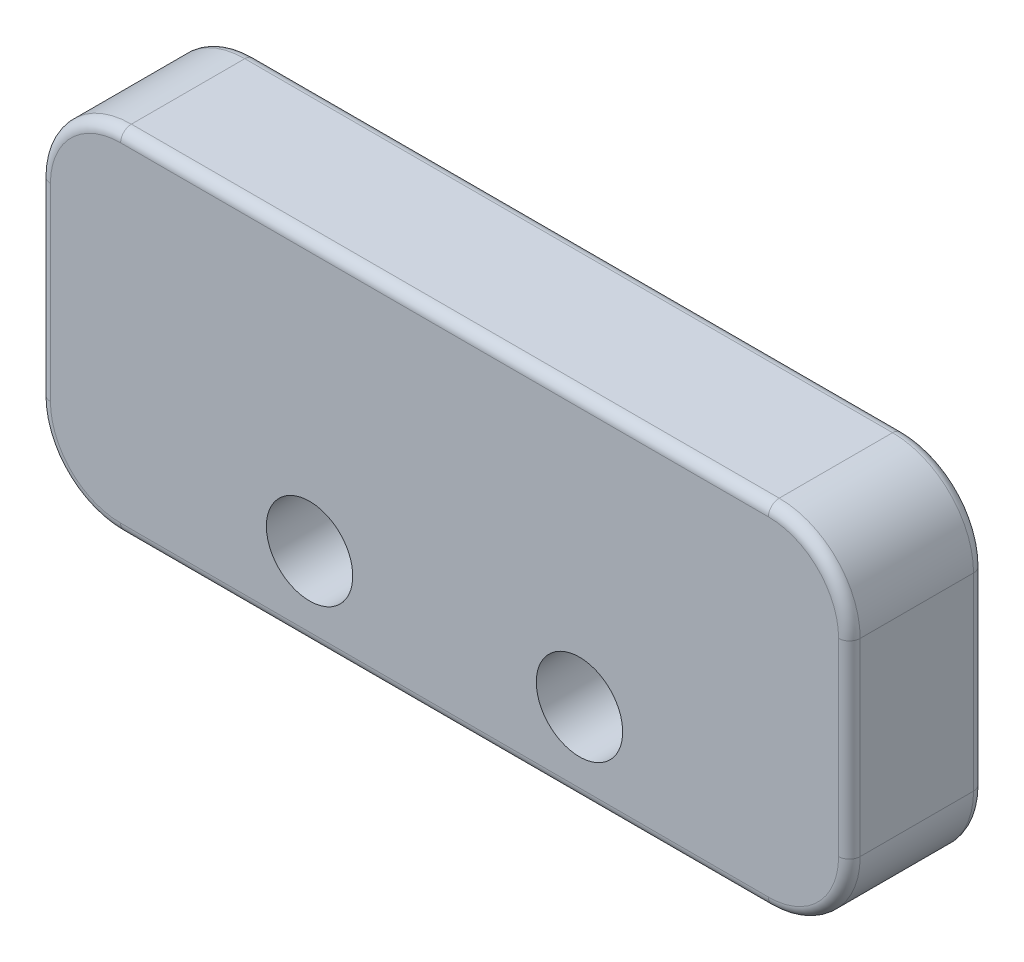
ISO-10303-21;
HEADER;
FILE_DESCRIPTION(('STEP AP214'),'2;1');
FILE_NAME('part.step','',(''),(''),'','','');
FILE_SCHEMA(('AUTOMOTIVE_DESIGN { 1 0 10303 214 1 1 1 1 }'));
ENDSEC;
DATA;
#1=APPLICATION_CONTEXT('core data for automotive mechanical design processes');
#2=APPLICATION_PROTOCOL_DEFINITION('international standard','automotive_design',2000,#1);
#3=PRODUCT_CONTEXT('',#1,'mechanical');
#4=PRODUCT('Part','Part','',(#3));
#5=PRODUCT_RELATED_PRODUCT_CATEGORY('part','',(#4));
#6=PRODUCT_DEFINITION_FORMATION('','',#4);
#7=PRODUCT_DEFINITION_CONTEXT('part definition',#1,'design');
#8=PRODUCT_DEFINITION('design','',#6,#7);
#9=PRODUCT_DEFINITION_SHAPE('','',#8);
#10=(LENGTH_UNIT() NAMED_UNIT(*) SI_UNIT(.MILLI.,.METRE.));
#11=(NAMED_UNIT(*) PLANE_ANGLE_UNIT() SI_UNIT($,.RADIAN.));
#12=(NAMED_UNIT(*) SI_UNIT($,.STERADIAN.) SOLID_ANGLE_UNIT());
#13=UNCERTAINTY_MEASURE_WITH_UNIT(LENGTH_MEASURE(1.E-05),#10,'distance_accuracy_value','');
#14=(GEOMETRIC_REPRESENTATION_CONTEXT(3) GLOBAL_UNCERTAINTY_ASSIGNED_CONTEXT((#13)) GLOBAL_UNIT_ASSIGNED_CONTEXT((#10,
#11,#12)) REPRESENTATION_CONTEXT('',''));
#15=CARTESIAN_POINT('',(0.,0.,0.));
#16=DIRECTION('',(0.,0.,1.));
#17=DIRECTION('',(1.,0.,0.));
#18=AXIS2_PLACEMENT_3D('',#15,#16,#17);
#19=CARTESIAN_POINT('',(0.,0.,5.));
#20=DIRECTION('',(1.,0.,0.));
#21=DIRECTION('',(0.,1.,0.));
#22=AXIS2_PLACEMENT_3D('',#19,#20,#21);
#23=PLANE('',#22);
#24=DIRECTION('',(0.,0.,-1.));
#25=VECTOR('',#24,1.);
#26=CARTESIAN_POINT('',(0.,-10.,5.));
#27=LINE('',#26,#25);
#28=CARTESIAN_POINT('',(0.,-10.,0.4));
#29=VERTEX_POINT('',#28);
#30=CARTESIAN_POINT('',(0.,-10.,4.6));
#31=VERTEX_POINT('',#30);
#32=EDGE_CURVE('E280',#29,#31,#27,.F.);
#33=ORIENTED_EDGE('',*,*,#32,.T.);
#34=DIRECTION('',(0.,-1.,0.));
#35=VECTOR('',#34,1.);
#36=CARTESIAN_POINT('',(0.,-3.,4.6));
#37=LINE('',#36,#35);
#38=CARTESIAN_POINT('',(0.,-3.,4.6));
#39=VERTEX_POINT('',#38);
#40=EDGE_CURVE('E202',#31,#39,#37,.F.);
#41=ORIENTED_EDGE('',*,*,#40,.T.);
#42=DIRECTION('',(0.,0.,-1.));
#43=VECTOR('',#42,1.);
#44=CARTESIAN_POINT('',(0.,-3.,5.));
#45=LINE('',#44,#43);
#46=CARTESIAN_POINT('',(0.,-3.,0.4));
#47=VERTEX_POINT('',#46);
#48=EDGE_CURVE('E339',#39,#47,#45,.T.);
#49=ORIENTED_EDGE('',*,*,#48,.T.);
#50=DIRECTION('',(0.,-1.,0.));
#51=VECTOR('',#50,1.);
#52=CARTESIAN_POINT('',(0.,0.,0.4));
#53=LINE('',#52,#51);
#54=EDGE_CURVE('E200',#47,#29,#53,.T.);
#55=ORIENTED_EDGE('',*,*,#54,.T.);
#56=EDGE_LOOP('',(#33,#41,#49,#55));
#57=FACE_BOUND('',#56,.T.);
#58=ADVANCED_FACE('F32',(#57),#23,.F.);
#59=CARTESIAN_POINT('',(0.,-13.,5.));
#60=DIRECTION('',(0.,1.,0.));
#61=DIRECTION('',(0.,0.,1.));
#62=AXIS2_PLACEMENT_3D('',#59,#60,#61);
#63=PLANE('',#62);
#64=DIRECTION('',(0.,0.,-1.));
#65=VECTOR('',#64,1.);
#66=CARTESIAN_POINT('',(27.,-13.,5.));
#67=LINE('',#66,#65);
#68=CARTESIAN_POINT('',(27.,-13.,0.4));
#69=VERTEX_POINT('',#68);
#70=CARTESIAN_POINT('',(27.,-13.,4.6));
#71=VERTEX_POINT('',#70);
#72=EDGE_CURVE('E287',#69,#71,#67,.F.);
#73=ORIENTED_EDGE('',*,*,#72,.T.);
#74=DIRECTION('',(1.,0.,0.));
#75=VECTOR('',#74,1.);
#76=CARTESIAN_POINT('',(3.,-13.,4.6));
#77=LINE('',#76,#75);
#78=CARTESIAN_POINT('',(3.,-13.,4.6));
#79=VERTEX_POINT('',#78);
#80=EDGE_CURVE('E194',#71,#79,#77,.F.);
#81=ORIENTED_EDGE('',*,*,#80,.T.);
#82=DIRECTION('',(0.,0.,-1.));
#83=VECTOR('',#82,1.);
#84=CARTESIAN_POINT('',(3.,-13.,5.));
#85=LINE('',#84,#83);
#86=CARTESIAN_POINT('',(3.,-13.,0.4));
#87=VERTEX_POINT('',#86);
#88=EDGE_CURVE('E277',#79,#87,#85,.T.);
#89=ORIENTED_EDGE('',*,*,#88,.T.);
#90=DIRECTION('',(1.,0.,0.));
#91=VECTOR('',#90,1.);
#92=CARTESIAN_POINT('',(0.,-13.,0.4));
#93=LINE('',#92,#91);
#94=EDGE_CURVE('E192',#87,#69,#93,.T.);
#95=ORIENTED_EDGE('',*,*,#94,.T.);
#96=EDGE_LOOP('',(#73,#81,#89,#95));
#97=FACE_BOUND('',#96,.T.);
#98=ADVANCED_FACE('F283',(#97),#63,.F.);
#99=CARTESIAN_POINT('',(30.,0.,5.));
#100=DIRECTION('',(-1.,0.,0.));
#101=DIRECTION('',(0.,0.,1.));
#102=AXIS2_PLACEMENT_3D('',#99,#100,#101);
#103=PLANE('',#102);
#104=DIRECTION('',(0.,0.,-1.));
#105=VECTOR('',#104,1.);
#106=CARTESIAN_POINT('',(30.,-3.,5.));
#107=LINE('',#106,#105);
#108=CARTESIAN_POINT('',(30.,-3.,0.4));
#109=VERTEX_POINT('',#108);
#110=CARTESIAN_POINT('',(30.,-3.,4.6));
#111=VERTEX_POINT('',#110);
#112=EDGE_CURVE('E286',#109,#111,#107,.F.);
#113=ORIENTED_EDGE('',*,*,#112,.T.);
#114=DIRECTION('',(0.,1.,0.));
#115=VECTOR('',#114,1.);
#116=CARTESIAN_POINT('',(30.,-9.99999999999999,4.6));
#117=LINE('',#116,#115);
#118=CARTESIAN_POINT('',(30.,-10.,4.6));
#119=VERTEX_POINT('',#118);
#120=EDGE_CURVE('E186',#111,#119,#117,.F.);
#121=ORIENTED_EDGE('',*,*,#120,.T.);
#122=DIRECTION('',(0.,0.,-1.));
#123=VECTOR('',#122,1.);
#124=CARTESIAN_POINT('',(30.,-10.,5.));
#125=LINE('',#124,#123);
#126=CARTESIAN_POINT('',(30.,-10.,0.4));
#127=VERTEX_POINT('',#126);
#128=EDGE_CURVE('E168',#119,#127,#125,.T.);
#129=ORIENTED_EDGE('',*,*,#128,.T.);
#130=DIRECTION('',(0.,1.,0.));
#131=VECTOR('',#130,1.);
#132=CARTESIAN_POINT('',(30.,0.,0.4));
#133=LINE('',#132,#131);
#134=EDGE_CURVE('E184',#127,#109,#133,.T.);
#135=ORIENTED_EDGE('',*,*,#134,.T.);
#136=EDGE_LOOP('',(#113,#121,#129,#135));
#137=FACE_BOUND('',#136,.T.);
#138=ADVANCED_FACE('F321',(#137),#103,.F.);
#139=CARTESIAN_POINT('',(0.,0.,5.));
#140=DIRECTION('',(0.,-1.,0.));
#141=DIRECTION('',(0.,0.,-1.));
#142=AXIS2_PLACEMENT_3D('',#139,#140,#141);
#143=PLANE('',#142);
#144=DIRECTION('',(0.,0.,-1.));
#145=VECTOR('',#144,1.);
#146=CARTESIAN_POINT('',(3.,0.,5.));
#147=LINE('',#146,#145);
#148=CARTESIAN_POINT('',(3.,0.,0.4));
#149=VERTEX_POINT('',#148);
#150=CARTESIAN_POINT('',(3.,0.,4.6));
#151=VERTEX_POINT('',#150);
#152=EDGE_CURVE('E291',#149,#151,#147,.F.);
#153=ORIENTED_EDGE('',*,*,#152,.T.);
#154=DIRECTION('',(-1.,0.,0.));
#155=VECTOR('',#154,1.);
#156=CARTESIAN_POINT('',(27.,0.,4.6));
#157=LINE('',#156,#155);
#158=CARTESIAN_POINT('',(27.,0.,4.6));
#159=VERTEX_POINT('',#158);
#160=EDGE_CURVE('E11',#151,#159,#157,.F.);
#161=ORIENTED_EDGE('',*,*,#160,.T.);
#162=DIRECTION('',(0.,0.,-1.));
#163=VECTOR('',#162,1.);
#164=CARTESIAN_POINT('',(27.,0.,5.));
#165=LINE('',#164,#163);
#166=CARTESIAN_POINT('',(27.,0.,0.4));
#167=VERTEX_POINT('',#166);
#168=EDGE_CURVE('E320',#159,#167,#165,.T.);
#169=ORIENTED_EDGE('',*,*,#168,.T.);
#170=DIRECTION('',(-1.,0.,0.));
#171=VECTOR('',#170,1.);
#172=CARTESIAN_POINT('',(0.,0.,0.4));
#173=LINE('',#172,#171);
#174=EDGE_CURVE('E41',#167,#149,#173,.T.);
#175=ORIENTED_EDGE('',*,*,#174,.T.);
#176=EDGE_LOOP('',(#153,#161,#169,#175));
#177=FACE_BOUND('',#176,.T.);
#178=ADVANCED_FACE('F338',(#177),#143,.F.);
#179=CARTESIAN_POINT('',(0.,0.,5.));
#180=DIRECTION('',(0.,0.,1.));
#181=DIRECTION('',(1.,0.,0.));
#182=AXIS2_PLACEMENT_3D('',#179,#180,#181);
#183=PLANE('',#182);
#184=DIRECTION('',(0.,1.,0.));
#185=VECTOR('',#184,1.);
#186=CARTESIAN_POINT('',(29.6,-3.,5.));
#187=LINE('',#186,#185);
#188=CARTESIAN_POINT('',(29.6,-10.,5.));
#189=VERTEX_POINT('',#188);
#190=CARTESIAN_POINT('',(29.6,-3.,5.));
#191=VERTEX_POINT('',#190);
#192=EDGE_CURVE('E173',#189,#191,#187,.T.);
#193=ORIENTED_EDGE('',*,*,#192,.T.);
#194=CARTESIAN_POINT('',(27.,-3.,5.));
#195=DIRECTION('',(0.,0.,1.));
#196=DIRECTION('',(1.,0.,0.));
#197=AXIS2_PLACEMENT_3D('',#194,#195,#196);
#198=CIRCLE('',#197,2.6);
#199=CARTESIAN_POINT('',(27.,-0.4,5.));
#200=VERTEX_POINT('',#199);
#201=EDGE_CURVE('E153',#191,#200,#198,.T.);
#202=ORIENTED_EDGE('',*,*,#201,.T.);
#203=DIRECTION('',(-1.,0.,0.));
#204=VECTOR('',#203,1.);
#205=CARTESIAN_POINT('',(3.,-0.4,5.));
#206=LINE('',#205,#204);
#207=CARTESIAN_POINT('',(3.,-0.4,5.));
#208=VERTEX_POINT('',#207);
#209=EDGE_CURVE('E161',#200,#208,#206,.T.);
#210=ORIENTED_EDGE('',*,*,#209,.T.);
#211=CARTESIAN_POINT('',(3.,-3.,5.));
#212=DIRECTION('',(0.,0.,1.));
#213=DIRECTION('',(1.,0.,0.));
#214=AXIS2_PLACEMENT_3D('',#211,#212,#213);
#215=CIRCLE('',#214,2.6);
#216=CARTESIAN_POINT('',(0.4,-3.,5.));
#217=VERTEX_POINT('',#216);
#218=EDGE_CURVE('E167',#208,#217,#215,.T.);
#219=ORIENTED_EDGE('',*,*,#218,.T.);
#220=DIRECTION('',(0.,-1.,0.));
#221=VECTOR('',#220,1.);
#222=CARTESIAN_POINT('',(0.400000000000001,-9.99999999999999,5.));
#223=LINE('',#222,#221);
#224=CARTESIAN_POINT('',(0.400000000000001,-10.,5.));
#225=VERTEX_POINT('',#224);
#226=EDGE_CURVE('E298',#217,#225,#223,.T.);
#227=ORIENTED_EDGE('',*,*,#226,.T.);
#228=CARTESIAN_POINT('',(3.,-10.,5.));
#229=DIRECTION('',(0.,0.,1.));
#230=DIRECTION('',(1.,0.,0.));
#231=AXIS2_PLACEMENT_3D('',#228,#229,#230);
#232=CIRCLE('',#231,2.6);
#233=CARTESIAN_POINT('',(3.,-12.6,5.));
#234=VERTEX_POINT('',#233);
#235=EDGE_CURVE('E300',#225,#234,#232,.T.);
#236=ORIENTED_EDGE('',*,*,#235,.T.);
#237=DIRECTION('',(1.,0.,0.));
#238=VECTOR('',#237,1.);
#239=CARTESIAN_POINT('',(27.,-12.6,5.));
#240=LINE('',#239,#238);
#241=CARTESIAN_POINT('',(27.,-12.6,5.));
#242=VERTEX_POINT('',#241);
#243=EDGE_CURVE('E302',#234,#242,#240,.T.);
#244=ORIENTED_EDGE('',*,*,#243,.T.);
#245=CARTESIAN_POINT('',(27.,-10.,5.));
#246=DIRECTION('',(0.,0.,1.));
#247=DIRECTION('',(1.,0.,0.));
#248=AXIS2_PLACEMENT_3D('',#245,#246,#247);
#249=CIRCLE('',#248,2.6);
#250=EDGE_CURVE('E179',#242,#189,#249,.T.);
#251=ORIENTED_EDGE('',*,*,#250,.T.);
#252=EDGE_LOOP('',(#193,#202,#210,#219,#227,#236,#244,#251));
#253=FACE_BOUND('',#252,.T.);
#254=CARTESIAN_POINT('',(10.,-10.,5.));
#255=DIRECTION('',(0.,0.,-1.));
#256=DIRECTION('',(-1.,0.,0.));
#257=AXIS2_PLACEMENT_3D('',#254,#255,#256);
#258=CIRCLE('',#257,1.6);
#259=CARTESIAN_POINT('',(8.4,-10.,5.));
#260=VERTEX_POINT('',#259);
#261=EDGE_CURVE('E349',#260,#260,#258,.T.);
#262=ORIENTED_EDGE('',*,*,#261,.T.);
#263=EDGE_LOOP('',(#262));
#264=FACE_BOUND('',#263,.T.);
#265=CARTESIAN_POINT('',(20.,-10.,5.));
#266=DIRECTION('',(0.,0.,-1.));
#267=DIRECTION('',(-1.,0.,0.));
#268=AXIS2_PLACEMENT_3D('',#265,#266,#267);
#269=CIRCLE('',#268,1.6);
#270=CARTESIAN_POINT('',(18.4,-10.,5.));
#271=VERTEX_POINT('',#270);
#272=EDGE_CURVE('E345',#271,#271,#269,.T.);
#273=ORIENTED_EDGE('',*,*,#272,.T.);
#274=EDGE_LOOP('',(#273));
#275=FACE_BOUND('',#274,.T.);
#276=ADVANCED_FACE('F170',(#253,#264,#275),#183,.T.);
#277=CARTESIAN_POINT('',(0.,0.,0.));
#278=DIRECTION('',(0.,0.,1.));
#279=DIRECTION('',(1.,0.,0.));
#280=AXIS2_PLACEMENT_3D('',#277,#278,#279);
#281=PLANE('',#280);
#282=DIRECTION('',(-1.,0.,0.));
#283=VECTOR('',#282,1.);
#284=CARTESIAN_POINT('',(0.,-0.4,0.));
#285=LINE('',#284,#283);
#286=CARTESIAN_POINT('',(3.,-0.4,0.));
#287=VERTEX_POINT('',#286);
#288=CARTESIAN_POINT('',(27.,-0.4,0.));
#289=VERTEX_POINT('',#288);
#290=EDGE_CURVE('E208',#287,#289,#285,.F.);
#291=ORIENTED_EDGE('',*,*,#290,.T.);
#292=CARTESIAN_POINT('',(27.,-3.,0.));
#293=DIRECTION('',(0.,0.,1.));
#294=DIRECTION('',(1.,0.,0.));
#295=AXIS2_PLACEMENT_3D('',#292,#293,#294);
#296=CIRCLE('',#295,2.6);
#297=CARTESIAN_POINT('',(29.6,-3.,0.));
#298=VERTEX_POINT('',#297);
#299=EDGE_CURVE('E221',#289,#298,#296,.F.);
#300=ORIENTED_EDGE('',*,*,#299,.T.);
#301=DIRECTION('',(0.,1.,0.));
#302=VECTOR('',#301,1.);
#303=CARTESIAN_POINT('',(29.6,0.,0.));
#304=LINE('',#303,#302);
#305=CARTESIAN_POINT('',(29.6,-10.,0.));
#306=VERTEX_POINT('',#305);
#307=EDGE_CURVE('E56',#298,#306,#304,.F.);
#308=ORIENTED_EDGE('',*,*,#307,.T.);
#309=CARTESIAN_POINT('',(27.,-10.,0.));
#310=DIRECTION('',(0.,0.,1.));
#311=DIRECTION('',(1.,0.,0.));
#312=AXIS2_PLACEMENT_3D('',#309,#310,#311);
#313=CIRCLE('',#312,2.6);
#314=CARTESIAN_POINT('',(27.,-12.6,0.));
#315=VERTEX_POINT('',#314);
#316=EDGE_CURVE('E218',#306,#315,#313,.F.);
#317=ORIENTED_EDGE('',*,*,#316,.T.);
#318=DIRECTION('',(1.,0.,0.));
#319=VECTOR('',#318,1.);
#320=CARTESIAN_POINT('',(0.,-12.6,0.));
#321=LINE('',#320,#319);
#322=CARTESIAN_POINT('',(3.,-12.6,0.));
#323=VERTEX_POINT('',#322);
#324=EDGE_CURVE('E216',#315,#323,#321,.F.);
#325=ORIENTED_EDGE('',*,*,#324,.T.);
#326=CARTESIAN_POINT('',(3.,-10.,0.));
#327=DIRECTION('',(0.,0.,1.));
#328=DIRECTION('',(1.,0.,0.));
#329=AXIS2_PLACEMENT_3D('',#326,#327,#328);
#330=CIRCLE('',#329,2.6);
#331=CARTESIAN_POINT('',(0.400000000000001,-10.,0.));
#332=VERTEX_POINT('',#331);
#333=EDGE_CURVE('E214',#323,#332,#330,.F.);
#334=ORIENTED_EDGE('',*,*,#333,.T.);
#335=DIRECTION('',(0.,-1.,0.));
#336=VECTOR('',#335,1.);
#337=CARTESIAN_POINT('',(0.4,0.,0.));
#338=LINE('',#337,#336);
#339=CARTESIAN_POINT('',(0.4,-3.,0.));
#340=VERTEX_POINT('',#339);
#341=EDGE_CURVE('E212',#332,#340,#338,.F.);
#342=ORIENTED_EDGE('',*,*,#341,.T.);
#343=CARTESIAN_POINT('',(3.,-3.,0.));
#344=DIRECTION('',(0.,0.,1.));
#345=DIRECTION('',(1.,0.,0.));
#346=AXIS2_PLACEMENT_3D('',#343,#344,#345);
#347=CIRCLE('',#346,2.6);
#348=EDGE_CURVE('E210',#340,#287,#347,.F.);
#349=ORIENTED_EDGE('',*,*,#348,.T.);
#350=EDGE_LOOP('',(#291,#300,#308,#317,#325,#334,#342,#349));
#351=FACE_BOUND('',#350,.T.);
#352=CARTESIAN_POINT('',(10.,-10.,0.));
#353=DIRECTION('',(0.,0.,-1.));
#354=DIRECTION('',(-1.,0.,0.));
#355=AXIS2_PLACEMENT_3D('',#352,#353,#354);
#356=CIRCLE('',#355,1.6);
#357=CARTESIAN_POINT('',(8.4,-10.,0.));
#358=VERTEX_POINT('',#357);
#359=EDGE_CURVE('E241',#358,#358,#356,.T.);
#360=ORIENTED_EDGE('',*,*,#359,.F.);
#361=EDGE_LOOP('',(#360));
#362=FACE_BOUND('',#361,.T.);
#363=CARTESIAN_POINT('',(20.,-10.,0.));
#364=DIRECTION('',(0.,0.,-1.));
#365=DIRECTION('',(-1.,0.,0.));
#366=AXIS2_PLACEMENT_3D('',#363,#364,#365);
#367=CIRCLE('',#366,1.6);
#368=CARTESIAN_POINT('',(18.4,-10.,0.));
#369=VERTEX_POINT('',#368);
#370=EDGE_CURVE('E346',#369,#369,#367,.T.);
#371=ORIENTED_EDGE('',*,*,#370,.F.);
#372=EDGE_LOOP('',(#371));
#373=FACE_BOUND('',#372,.T.);
#374=ADVANCED_FACE('F326',(#351,#362,#373),#281,.F.);
#375=CARTESIAN_POINT('',(20.,-10.,5.));
#376=DIRECTION('',(0.,0.,-1.));
#377=DIRECTION('',(-1.,0.,0.));
#378=AXIS2_PLACEMENT_3D('',#375,#376,#377);
#379=CYLINDRICAL_SURFACE('',#378,1.6);
#380=ORIENTED_EDGE('',*,*,#272,.F.);
#381=EDGE_LOOP('',(#380));
#382=FACE_BOUND('',#381,.T.);
#383=ORIENTED_EDGE('',*,*,#370,.T.);
#384=EDGE_LOOP('',(#383));
#385=FACE_BOUND('',#384,.T.);
#386=ADVANCED_FACE('F362',(#382,#385),#379,.F.);
#387=CARTESIAN_POINT('',(10.,-10.,5.));
#388=DIRECTION('',(0.,0.,-1.));
#389=DIRECTION('',(-1.,0.,0.));
#390=AXIS2_PLACEMENT_3D('',#387,#388,#389);
#391=CYLINDRICAL_SURFACE('',#390,1.6);
#392=ORIENTED_EDGE('',*,*,#261,.F.);
#393=EDGE_LOOP('',(#392));
#394=FACE_BOUND('',#393,.T.);
#395=ORIENTED_EDGE('',*,*,#359,.T.);
#396=EDGE_LOOP('',(#395));
#397=FACE_BOUND('',#396,.T.);
#398=ADVANCED_FACE('F358',(#394,#397),#391,.F.);
#399=CARTESIAN_POINT('',(3.,-3.,5.));
#400=DIRECTION('',(0.,0.,-1.));
#401=DIRECTION('',(-1.,0.,0.));
#402=AXIS2_PLACEMENT_3D('',#399,#400,#401);
#403=CYLINDRICAL_SURFACE('',#402,3.);
#404=ORIENTED_EDGE('',*,*,#48,.F.);
#405=CARTESIAN_POINT('',(3.,-3.,4.6));
#406=DIRECTION('',(0.,0.,1.));
#407=DIRECTION('',(1.,0.,0.));
#408=AXIS2_PLACEMENT_3D('',#405,#406,#407);
#409=CIRCLE('',#408,3.);
#410=EDGE_CURVE('E206',#39,#151,#409,.F.);
#411=ORIENTED_EDGE('',*,*,#410,.T.);
#412=ORIENTED_EDGE('',*,*,#152,.F.);
#413=CARTESIAN_POINT('',(3.,-3.,0.4));
#414=DIRECTION('',(0.,0.,1.));
#415=DIRECTION('',(1.,0.,0.));
#416=AXIS2_PLACEMENT_3D('',#413,#414,#415);
#417=CIRCLE('',#416,3.);
#418=EDGE_CURVE('E204',#149,#47,#417,.T.);
#419=ORIENTED_EDGE('',*,*,#418,.T.);
#420=EDGE_LOOP('',(#404,#411,#412,#419));
#421=FACE_BOUND('',#420,.T.);
#422=ADVANCED_FACE('F361',(#421),#403,.T.);
#423=CARTESIAN_POINT('',(3.,-10.,5.));
#424=DIRECTION('',(0.,0.,-1.));
#425=DIRECTION('',(-1.,0.,0.));
#426=AXIS2_PLACEMENT_3D('',#423,#424,#425);
#427=CYLINDRICAL_SURFACE('',#426,3.);
#428=ORIENTED_EDGE('',*,*,#88,.F.);
#429=CARTESIAN_POINT('',(3.,-10.,4.6));
#430=DIRECTION('',(0.,0.,1.));
#431=DIRECTION('',(1.,0.,0.));
#432=AXIS2_PLACEMENT_3D('',#429,#430,#431);
#433=CIRCLE('',#432,3.);
#434=EDGE_CURVE('E198',#79,#31,#433,.F.);
#435=ORIENTED_EDGE('',*,*,#434,.T.);
#436=ORIENTED_EDGE('',*,*,#32,.F.);
#437=CARTESIAN_POINT('',(3.,-10.,0.4));
#438=DIRECTION('',(0.,0.,1.));
#439=DIRECTION('',(1.,0.,0.));
#440=AXIS2_PLACEMENT_3D('',#437,#438,#439);
#441=CIRCLE('',#440,3.);
#442=EDGE_CURVE('E196',#29,#87,#441,.T.);
#443=ORIENTED_EDGE('',*,*,#442,.T.);
#444=EDGE_LOOP('',(#428,#435,#436,#443));
#445=FACE_BOUND('',#444,.T.);
#446=ADVANCED_FACE('F276',(#445),#427,.T.);
#447=CARTESIAN_POINT('',(27.,-10.,5.));
#448=DIRECTION('',(0.,0.,-1.));
#449=DIRECTION('',(-1.,0.,0.));
#450=AXIS2_PLACEMENT_3D('',#447,#448,#449);
#451=CYLINDRICAL_SURFACE('',#450,3.);
#452=ORIENTED_EDGE('',*,*,#128,.F.);
#453=CARTESIAN_POINT('',(27.,-10.,4.6));
#454=DIRECTION('',(0.,0.,1.));
#455=DIRECTION('',(1.,0.,0.));
#456=AXIS2_PLACEMENT_3D('',#453,#454,#455);
#457=CIRCLE('',#456,3.);
#458=EDGE_CURVE('E190',#119,#71,#457,.F.);
#459=ORIENTED_EDGE('',*,*,#458,.T.);
#460=ORIENTED_EDGE('',*,*,#72,.F.);
#461=CARTESIAN_POINT('',(27.,-10.,0.4));
#462=DIRECTION('',(0.,0.,1.));
#463=DIRECTION('',(1.,0.,0.));
#464=AXIS2_PLACEMENT_3D('',#461,#462,#463);
#465=CIRCLE('',#464,3.);
#466=EDGE_CURVE('E188',#69,#127,#465,.T.);
#467=ORIENTED_EDGE('',*,*,#466,.T.);
#468=EDGE_LOOP('',(#452,#459,#460,#467));
#469=FACE_BOUND('',#468,.T.);
#470=ADVANCED_FACE('F391',(#469),#451,.T.);
#471=CARTESIAN_POINT('',(27.,-3.,5.));
#472=DIRECTION('',(0.,0.,-1.));
#473=DIRECTION('',(-1.,0.,0.));
#474=AXIS2_PLACEMENT_3D('',#471,#472,#473);
#475=CYLINDRICAL_SURFACE('',#474,3.);
#476=ORIENTED_EDGE('',*,*,#168,.F.);
#477=CARTESIAN_POINT('',(27.,-3.,4.6));
#478=DIRECTION('',(0.,0.,1.));
#479=DIRECTION('',(1.,0.,0.));
#480=AXIS2_PLACEMENT_3D('',#477,#478,#479);
#481=CIRCLE('',#480,3.);
#482=EDGE_CURVE('E155',#159,#111,#481,.F.);
#483=ORIENTED_EDGE('',*,*,#482,.T.);
#484=ORIENTED_EDGE('',*,*,#112,.F.);
#485=CARTESIAN_POINT('',(27.,-3.,0.4));
#486=DIRECTION('',(0.,0.,1.));
#487=DIRECTION('',(1.,0.,0.));
#488=AXIS2_PLACEMENT_3D('',#485,#486,#487);
#489=CIRCLE('',#488,3.);
#490=EDGE_CURVE('E175',#109,#167,#489,.T.);
#491=ORIENTED_EDGE('',*,*,#490,.T.);
#492=EDGE_LOOP('',(#476,#483,#484,#491));
#493=FACE_BOUND('',#492,.T.);
#494=ADVANCED_FACE('F318',(#493),#475,.T.);
#495=CARTESIAN_POINT('',(3.,-10.,4.6));
#496=DIRECTION('',(0.,0.,1.));
#497=DIRECTION('',(1.,0.,0.));
#498=AXIS2_PLACEMENT_3D('',#495,#496,#497);
#499=TOROIDAL_SURFACE('',#498,2.6,0.4);
#500=CARTESIAN_POINT('',(0.400000000000001,-10.,4.6));
#501=DIRECTION('',(0.,1.,0.));
#502=DIRECTION('',(0.,0.,1.));
#503=AXIS2_PLACEMENT_3D('',#500,#501,#502);
#504=CIRCLE('',#503,0.4);
#505=EDGE_CURVE('E235',#31,#225,#504,.T.);
#506=ORIENTED_EDGE('',*,*,#505,.F.);
#507=ORIENTED_EDGE('',*,*,#434,.F.);
#508=CARTESIAN_POINT('',(3.,-12.6,4.6));
#509=DIRECTION('',(1.,0.,0.));
#510=DIRECTION('',(0.,0.,-1.));
#511=AXIS2_PLACEMENT_3D('',#508,#509,#510);
#512=CIRCLE('',#511,0.4);
#513=EDGE_CURVE('E238',#234,#79,#512,.T.);
#514=ORIENTED_EDGE('',*,*,#513,.F.);
#515=ORIENTED_EDGE('',*,*,#235,.F.);
#516=EDGE_LOOP('',(#506,#507,#514,#515));
#517=FACE_BOUND('',#516,.T.);
#518=ADVANCED_FACE('F397',(#517),#499,.T.);
#519=CARTESIAN_POINT('',(0.,-12.6,4.6));
#520=DIRECTION('',(-1.,0.,0.));
#521=DIRECTION('',(0.,0.,1.));
#522=AXIS2_PLACEMENT_3D('',#519,#520,#521);
#523=CYLINDRICAL_SURFACE('',#522,0.4);
#524=ORIENTED_EDGE('',*,*,#513,.T.);
#525=ORIENTED_EDGE('',*,*,#80,.F.);
#526=CARTESIAN_POINT('',(27.,-12.6,4.6));
#527=DIRECTION('',(1.,0.,0.));
#528=DIRECTION('',(0.,0.,-1.));
#529=AXIS2_PLACEMENT_3D('',#526,#527,#528);
#530=CIRCLE('',#529,0.4);
#531=EDGE_CURVE('E232',#242,#71,#530,.T.);
#532=ORIENTED_EDGE('',*,*,#531,.F.);
#533=ORIENTED_EDGE('',*,*,#243,.F.);
#534=EDGE_LOOP('',(#524,#525,#532,#533));
#535=FACE_BOUND('',#534,.T.);
#536=ADVANCED_FACE('F413',(#535),#523,.T.);
#537=CARTESIAN_POINT('',(0.4,0.,4.6));
#538=DIRECTION('',(0.,1.,0.));
#539=DIRECTION('',(-1.,0.,0.));
#540=AXIS2_PLACEMENT_3D('',#537,#538,#539);
#541=CYLINDRICAL_SURFACE('',#540,0.4);
#542=ORIENTED_EDGE('',*,*,#505,.T.);
#543=ORIENTED_EDGE('',*,*,#226,.F.);
#544=CARTESIAN_POINT('',(0.4,-3.,4.6));
#545=DIRECTION('',(0.,1.,0.));
#546=DIRECTION('',(0.,0.,1.));
#547=AXIS2_PLACEMENT_3D('',#544,#545,#546);
#548=CIRCLE('',#547,0.4);
#549=EDGE_CURVE('E229',#39,#217,#548,.T.);
#550=ORIENTED_EDGE('',*,*,#549,.F.);
#551=ORIENTED_EDGE('',*,*,#40,.F.);
#552=EDGE_LOOP('',(#542,#543,#550,#551));
#553=FACE_BOUND('',#552,.T.);
#554=ADVANCED_FACE('F410',(#553),#541,.T.);
#555=CARTESIAN_POINT('',(27.,-10.,4.6));
#556=DIRECTION('',(0.,0.,1.));
#557=DIRECTION('',(1.,0.,0.));
#558=AXIS2_PLACEMENT_3D('',#555,#556,#557);
#559=TOROIDAL_SURFACE('',#558,2.6,0.4);
#560=ORIENTED_EDGE('',*,*,#531,.T.);
#561=ORIENTED_EDGE('',*,*,#458,.F.);
#562=CARTESIAN_POINT('',(29.6,-10.,4.6));
#563=DIRECTION('',(0.,1.,0.));
#564=DIRECTION('',(0.,0.,1.));
#565=AXIS2_PLACEMENT_3D('',#562,#563,#564);
#566=CIRCLE('',#565,0.4);
#567=EDGE_CURVE('E226',#189,#119,#566,.T.);
#568=ORIENTED_EDGE('',*,*,#567,.F.);
#569=ORIENTED_EDGE('',*,*,#250,.F.);
#570=EDGE_LOOP('',(#560,#561,#568,#569));
#571=FACE_BOUND('',#570,.T.);
#572=ADVANCED_FACE('F309',(#571),#559,.T.);
#573=CARTESIAN_POINT('',(3.,-3.,4.6));
#574=DIRECTION('',(0.,0.,1.));
#575=DIRECTION('',(1.,0.,0.));
#576=AXIS2_PLACEMENT_3D('',#573,#574,#575);
#577=TOROIDAL_SURFACE('',#576,2.6,0.4);
#578=ORIENTED_EDGE('',*,*,#549,.T.);
#579=ORIENTED_EDGE('',*,*,#218,.F.);
#580=CARTESIAN_POINT('',(3.,-0.4,4.6));
#581=DIRECTION('',(1.,0.,0.));
#582=DIRECTION('',(0.,0.,-1.));
#583=AXIS2_PLACEMENT_3D('',#580,#581,#582);
#584=CIRCLE('',#583,0.4);
#585=EDGE_CURVE('E164',#151,#208,#584,.T.);
#586=ORIENTED_EDGE('',*,*,#585,.F.);
#587=ORIENTED_EDGE('',*,*,#410,.F.);
#588=EDGE_LOOP('',(#578,#579,#586,#587));
#589=FACE_BOUND('',#588,.T.);
#590=ADVANCED_FACE('F404',(#589),#577,.T.);
#591=CARTESIAN_POINT('',(29.6,0.,4.6));
#592=DIRECTION('',(0.,-1.,0.));
#593=DIRECTION('',(0.,0.,-1.));
#594=AXIS2_PLACEMENT_3D('',#591,#592,#593);
#595=CYLINDRICAL_SURFACE('',#594,0.4);
#596=ORIENTED_EDGE('',*,*,#567,.T.);
#597=ORIENTED_EDGE('',*,*,#120,.F.);
#598=CARTESIAN_POINT('',(29.6,-3.,4.6));
#599=DIRECTION('',(0.,1.,0.));
#600=DIRECTION('',(0.,0.,1.));
#601=AXIS2_PLACEMENT_3D('',#598,#599,#600);
#602=CIRCLE('',#601,0.4);
#603=EDGE_CURVE('E158',#191,#111,#602,.T.);
#604=ORIENTED_EDGE('',*,*,#603,.F.);
#605=ORIENTED_EDGE('',*,*,#192,.F.);
#606=EDGE_LOOP('',(#596,#597,#604,#605));
#607=FACE_BOUND('',#606,.T.);
#608=ADVANCED_FACE('F312',(#607),#595,.T.);
#609=CARTESIAN_POINT('',(0.,-0.4,4.6));
#610=DIRECTION('',(1.,0.,0.));
#611=DIRECTION('',(0.,0.,-1.));
#612=AXIS2_PLACEMENT_3D('',#609,#610,#611);
#613=CYLINDRICAL_SURFACE('',#612,0.4);
#614=ORIENTED_EDGE('',*,*,#585,.T.);
#615=ORIENTED_EDGE('',*,*,#209,.F.);
#616=CARTESIAN_POINT('',(27.,-0.4,4.6));
#617=DIRECTION('',(1.,0.,0.));
#618=DIRECTION('',(0.,0.,-1.));
#619=AXIS2_PLACEMENT_3D('',#616,#617,#618);
#620=CIRCLE('',#619,0.4);
#621=EDGE_CURVE('E149',#159,#200,#620,.T.);
#622=ORIENTED_EDGE('',*,*,#621,.F.);
#623=ORIENTED_EDGE('',*,*,#160,.F.);
#624=EDGE_LOOP('',(#614,#615,#622,#623));
#625=FACE_BOUND('',#624,.T.);
#626=ADVANCED_FACE('F162',(#625),#613,.T.);
#627=CARTESIAN_POINT('',(27.,-3.,4.6));
#628=DIRECTION('',(0.,0.,1.));
#629=DIRECTION('',(1.,0.,0.));
#630=AXIS2_PLACEMENT_3D('',#627,#628,#629);
#631=TOROIDAL_SURFACE('',#630,2.6,0.4);
#632=ORIENTED_EDGE('',*,*,#603,.T.);
#633=ORIENTED_EDGE('',*,*,#482,.F.);
#634=ORIENTED_EDGE('',*,*,#621,.T.);
#635=ORIENTED_EDGE('',*,*,#201,.F.);
#636=EDGE_LOOP('',(#632,#633,#634,#635));
#637=FACE_BOUND('',#636,.T.);
#638=ADVANCED_FACE('F151',(#637),#631,.T.);
#639=CARTESIAN_POINT('',(3.,-10.,0.4));
#640=DIRECTION('',(0.,0.,1.));
#641=DIRECTION('',(1.,0.,0.));
#642=AXIS2_PLACEMENT_3D('',#639,#640,#641);
#643=TOROIDAL_SURFACE('',#642,2.6,0.4);
#644=CARTESIAN_POINT('',(3.,-12.6,0.4));
#645=DIRECTION('',(1.,0.,0.));
#646=DIRECTION('',(0.,0.,-1.));
#647=AXIS2_PLACEMENT_3D('',#644,#645,#646);
#648=CIRCLE('',#647,0.4);
#649=EDGE_CURVE('E256',#87,#323,#648,.T.);
#650=ORIENTED_EDGE('',*,*,#649,.F.);
#651=ORIENTED_EDGE('',*,*,#442,.F.);
#652=CARTESIAN_POINT('',(0.400000000000001,-10.,0.4));
#653=DIRECTION('',(0.,1.,0.));
#654=DIRECTION('',(0.,0.,1.));
#655=AXIS2_PLACEMENT_3D('',#652,#653,#654);
#656=CIRCLE('',#655,0.4);
#657=EDGE_CURVE('E36',#332,#29,#656,.T.);
#658=ORIENTED_EDGE('',*,*,#657,.F.);
#659=ORIENTED_EDGE('',*,*,#333,.F.);
#660=EDGE_LOOP('',(#650,#651,#658,#659));
#661=FACE_BOUND('',#660,.T.);
#662=ADVANCED_FACE('F34',(#661),#643,.T.);
#663=CARTESIAN_POINT('',(0.4,0.,0.4));
#664=DIRECTION('',(0.,-1.,0.));
#665=DIRECTION('',(1.,0.,0.));
#666=AXIS2_PLACEMENT_3D('',#663,#664,#665);
#667=CYLINDRICAL_SURFACE('',#666,0.4);
#668=ORIENTED_EDGE('',*,*,#657,.T.);
#669=ORIENTED_EDGE('',*,*,#54,.F.);
#670=CARTESIAN_POINT('',(0.4,-3.,0.4));
#671=DIRECTION('',(0.,1.,0.));
#672=DIRECTION('',(0.,0.,1.));
#673=AXIS2_PLACEMENT_3D('',#670,#671,#672);
#674=CIRCLE('',#673,0.4);
#675=EDGE_CURVE('E254',#340,#47,#674,.T.);
#676=ORIENTED_EDGE('',*,*,#675,.F.);
#677=ORIENTED_EDGE('',*,*,#341,.F.);
#678=EDGE_LOOP('',(#668,#669,#676,#677));
#679=FACE_BOUND('',#678,.T.);
#680=ADVANCED_FACE('F267',(#679),#667,.T.);
#681=CARTESIAN_POINT('',(0.,-12.6,0.4));
#682=DIRECTION('',(1.,0.,0.));
#683=DIRECTION('',(0.,0.,-1.));
#684=AXIS2_PLACEMENT_3D('',#681,#682,#683);
#685=CYLINDRICAL_SURFACE('',#684,0.4);
#686=ORIENTED_EDGE('',*,*,#649,.T.);
#687=ORIENTED_EDGE('',*,*,#324,.F.);
#688=CARTESIAN_POINT('',(27.,-12.6,0.4));
#689=DIRECTION('',(1.,0.,0.));
#690=DIRECTION('',(0.,0.,-1.));
#691=AXIS2_PLACEMENT_3D('',#688,#689,#690);
#692=CIRCLE('',#691,0.4);
#693=EDGE_CURVE('E251',#69,#315,#692,.T.);
#694=ORIENTED_EDGE('',*,*,#693,.F.);
#695=ORIENTED_EDGE('',*,*,#94,.F.);
#696=EDGE_LOOP('',(#686,#687,#694,#695));
#697=FACE_BOUND('',#696,.T.);
#698=ADVANCED_FACE('F434',(#697),#685,.T.);
#699=CARTESIAN_POINT('',(3.,-3.,0.4));
#700=DIRECTION('',(0.,0.,1.));
#701=DIRECTION('',(1.,0.,0.));
#702=AXIS2_PLACEMENT_3D('',#699,#700,#701);
#703=TOROIDAL_SURFACE('',#702,2.6,0.4);
#704=ORIENTED_EDGE('',*,*,#675,.T.);
#705=ORIENTED_EDGE('',*,*,#418,.F.);
#706=CARTESIAN_POINT('',(3.,-0.4,0.4));
#707=DIRECTION('',(1.,0.,0.));
#708=DIRECTION('',(0.,0.,-1.));
#709=AXIS2_PLACEMENT_3D('',#706,#707,#708);
#710=CIRCLE('',#709,0.4);
#711=EDGE_CURVE('E248',#287,#149,#710,.T.);
#712=ORIENTED_EDGE('',*,*,#711,.F.);
#713=ORIENTED_EDGE('',*,*,#348,.F.);
#714=EDGE_LOOP('',(#704,#705,#712,#713));
#715=FACE_BOUND('',#714,.T.);
#716=ADVANCED_FACE('F430',(#715),#703,.T.);
#717=CARTESIAN_POINT('',(27.,-10.,0.4));
#718=DIRECTION('',(0.,0.,1.));
#719=DIRECTION('',(1.,0.,0.));
#720=AXIS2_PLACEMENT_3D('',#717,#718,#719);
#721=TOROIDAL_SURFACE('',#720,2.6,0.4);
#722=ORIENTED_EDGE('',*,*,#693,.T.);
#723=ORIENTED_EDGE('',*,*,#316,.F.);
#724=CARTESIAN_POINT('',(29.6,-10.,0.4));
#725=DIRECTION('',(0.,1.,0.));
#726=DIRECTION('',(0.,0.,1.));
#727=AXIS2_PLACEMENT_3D('',#724,#725,#726);
#728=CIRCLE('',#727,0.4);
#729=EDGE_CURVE('E245',#127,#306,#728,.T.);
#730=ORIENTED_EDGE('',*,*,#729,.F.);
#731=ORIENTED_EDGE('',*,*,#466,.F.);
#732=EDGE_LOOP('',(#722,#723,#730,#731));
#733=FACE_BOUND('',#732,.T.);
#734=ADVANCED_FACE('F427',(#733),#721,.T.);
#735=CARTESIAN_POINT('',(0.,-0.4,0.4));
#736=DIRECTION('',(-1.,0.,0.));
#737=DIRECTION('',(0.,0.,1.));
#738=AXIS2_PLACEMENT_3D('',#735,#736,#737);
#739=CYLINDRICAL_SURFACE('',#738,0.4);
#740=ORIENTED_EDGE('',*,*,#711,.T.);
#741=ORIENTED_EDGE('',*,*,#174,.F.);
#742=CARTESIAN_POINT('',(27.,-0.4,0.4));
#743=DIRECTION('',(1.,0.,0.));
#744=DIRECTION('',(0.,0.,-1.));
#745=AXIS2_PLACEMENT_3D('',#742,#743,#744);
#746=CIRCLE('',#745,0.4);
#747=EDGE_CURVE('E243',#289,#167,#746,.T.);
#748=ORIENTED_EDGE('',*,*,#747,.F.);
#749=ORIENTED_EDGE('',*,*,#290,.F.);
#750=EDGE_LOOP('',(#740,#741,#748,#749));
#751=FACE_BOUND('',#750,.T.);
#752=ADVANCED_FACE('F333',(#751),#739,.T.);
#753=CARTESIAN_POINT('',(29.6,0.,0.4));
#754=DIRECTION('',(0.,1.,0.));
#755=DIRECTION('',(0.,0.,1.));
#756=AXIS2_PLACEMENT_3D('',#753,#754,#755);
#757=CYLINDRICAL_SURFACE('',#756,0.4);
#758=ORIENTED_EDGE('',*,*,#729,.T.);
#759=ORIENTED_EDGE('',*,*,#307,.F.);
#760=CARTESIAN_POINT('',(29.6,-3.,0.4));
#761=DIRECTION('',(0.,1.,0.));
#762=DIRECTION('',(0.,0.,1.));
#763=AXIS2_PLACEMENT_3D('',#760,#761,#762);
#764=CIRCLE('',#763,0.4);
#765=EDGE_CURVE('E49',#109,#298,#764,.T.);
#766=ORIENTED_EDGE('',*,*,#765,.F.);
#767=ORIENTED_EDGE('',*,*,#134,.F.);
#768=EDGE_LOOP('',(#758,#759,#766,#767));
#769=FACE_BOUND('',#768,.T.);
#770=ADVANCED_FACE('F325',(#769),#757,.T.);
#771=CARTESIAN_POINT('',(27.,-3.,0.4));
#772=DIRECTION('',(0.,0.,1.));
#773=DIRECTION('',(1.,0.,0.));
#774=AXIS2_PLACEMENT_3D('',#771,#772,#773);
#775=TOROIDAL_SURFACE('',#774,2.6,0.4);
#776=ORIENTED_EDGE('',*,*,#747,.T.);
#777=ORIENTED_EDGE('',*,*,#490,.F.);
#778=ORIENTED_EDGE('',*,*,#765,.T.);
#779=ORIENTED_EDGE('',*,*,#299,.F.);
#780=EDGE_LOOP('',(#776,#777,#778,#779));
#781=FACE_BOUND('',#780,.T.);
#782=ADVANCED_FACE('F330',(#781),#775,.T.);
#783=CLOSED_SHELL('',(#58,#98,#138,#178,#276,#374,#386,#398,#422,#446,#470,#494,#518,#536,#554,
#572,#590,#608,#626,#638,#662,#680,#698,#716,#734,#752,#770,#782));
#784=MANIFOLD_SOLID_BREP('B2',#783);
#785=ADVANCED_BREP_SHAPE_REPRESENTATION('',(#18,#784),#14);
#786=SHAPE_DEFINITION_REPRESENTATION(#9,#785);
ENDSEC;
END-ISO-10303-21;
